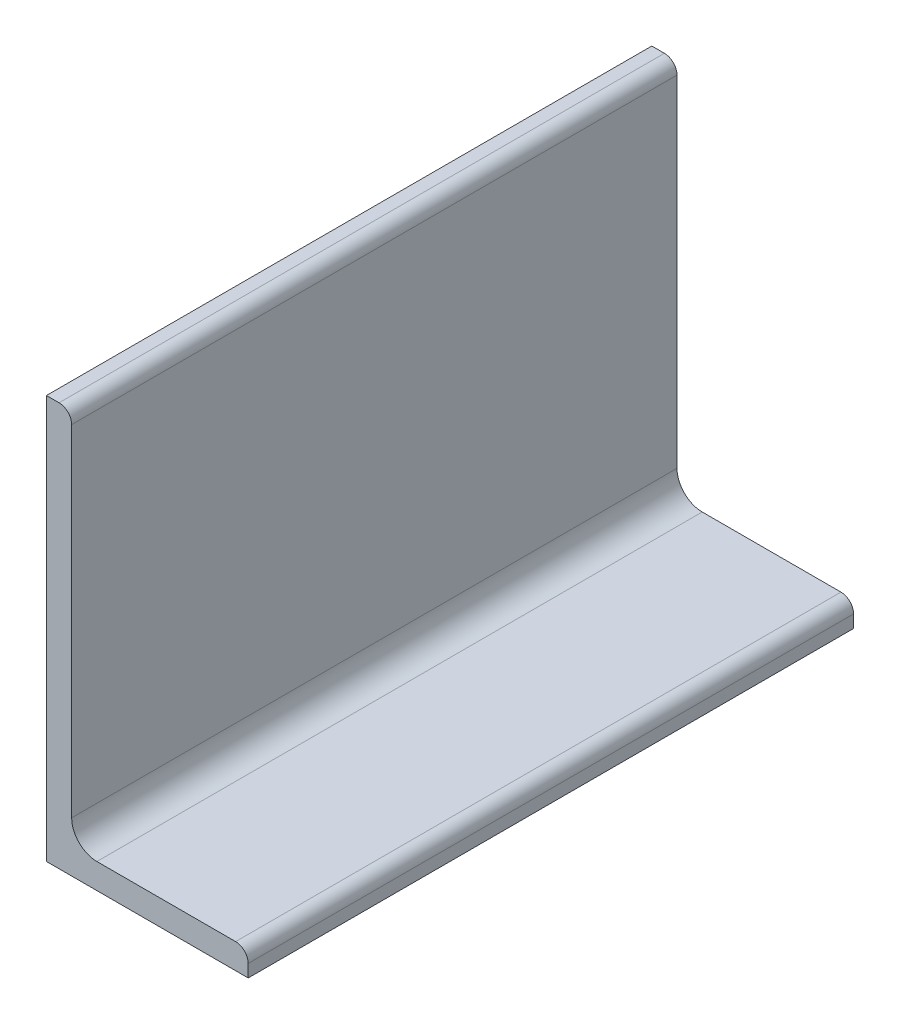
ISO-10303-21;
HEADER;
FILE_DESCRIPTION(('STEP AP214'),'2;1');
FILE_NAME('part.step','',(''),(''),'','','');
FILE_SCHEMA(('AUTOMOTIVE_DESIGN { 1 0 10303 214 1 1 1 1 }'));
ENDSEC;
DATA;
#1=APPLICATION_CONTEXT('core data for automotive mechanical design processes');
#2=APPLICATION_PROTOCOL_DEFINITION('international standard','automotive_design',2000,#1);
#3=PRODUCT_CONTEXT('',#1,'mechanical');
#4=PRODUCT('Part','Part','',(#3));
#5=PRODUCT_RELATED_PRODUCT_CATEGORY('part','',(#4));
#6=PRODUCT_DEFINITION_FORMATION('','',#4);
#7=PRODUCT_DEFINITION_CONTEXT('part definition',#1,'design');
#8=PRODUCT_DEFINITION('design','',#6,#7);
#9=PRODUCT_DEFINITION_SHAPE('','',#8);
#10=(LENGTH_UNIT() NAMED_UNIT(*) SI_UNIT(.MILLI.,.METRE.));
#11=(NAMED_UNIT(*) PLANE_ANGLE_UNIT() SI_UNIT($,.RADIAN.));
#12=(NAMED_UNIT(*) SI_UNIT($,.STERADIAN.) SOLID_ANGLE_UNIT());
#13=UNCERTAINTY_MEASURE_WITH_UNIT(LENGTH_MEASURE(1.E-05),#10,'distance_accuracy_value','');
#14=(GEOMETRIC_REPRESENTATION_CONTEXT(3) GLOBAL_UNCERTAINTY_ASSIGNED_CONTEXT((#13)) GLOBAL_UNIT_ASSIGNED_CONTEXT((#10,
#11,#12)) REPRESENTATION_CONTEXT('',''));
#15=CARTESIAN_POINT('',(0.,0.,0.));
#16=DIRECTION('',(0.,0.,1.));
#17=DIRECTION('',(1.,0.,0.));
#18=AXIS2_PLACEMENT_3D('',#15,#16,#17);
#19=CARTESIAN_POINT('',(0.865045893659089,203.678837479771,304.8));
#20=DIRECTION('',(1.,0.,0.));
#21=DIRECTION('',(0.,0.,-1.));
#22=AXIS2_PLACEMENT_3D('',#19,#20,#21);
#23=PLANE('',#22);
#24=DIRECTION('',(0.,-1.,0.));
#25=VECTOR('',#24,1.);
#26=CARTESIAN_POINT('',(0.865045893659089,203.678837479771,0.));
#27=LINE('',#26,#25);
#28=CARTESIAN_POINT('',(0.865045893659089,203.678837479771,0.));
#29=VERTEX_POINT('',#28);
#30=CARTESIAN_POINT('',(0.865045893659089,0.478837479771528,0.));
#31=VERTEX_POINT('',#30);
#32=EDGE_CURVE('E135',#29,#31,#27,.T.);
#33=ORIENTED_EDGE('',*,*,#32,.T.);
#34=DIRECTION('',(0.,0.,-1.));
#35=VECTOR('',#34,1.);
#36=CARTESIAN_POINT('',(0.865045893659089,0.478837479771528,304.8));
#37=LINE('',#36,#35);
#38=CARTESIAN_POINT('',(0.865045893659089,0.478837479771528,304.8));
#39=VERTEX_POINT('',#38);
#40=EDGE_CURVE('E11',#39,#31,#37,.T.);
#41=ORIENTED_EDGE('',*,*,#40,.F.);
#42=DIRECTION('',(0.,-1.,0.));
#43=VECTOR('',#42,1.);
#44=CARTESIAN_POINT('',(0.865045893659089,203.678837479771,304.8));
#45=LINE('',#44,#43);
#46=CARTESIAN_POINT('',(0.865045893659089,203.678837479771,304.8));
#47=VERTEX_POINT('',#46);
#48=EDGE_CURVE('E151',#47,#39,#45,.T.);
#49=ORIENTED_EDGE('',*,*,#48,.F.);
#50=DIRECTION('',(0.,0.,-1.));
#51=VECTOR('',#50,1.);
#52=CARTESIAN_POINT('',(0.865045893659089,203.678837479771,304.8));
#53=LINE('',#52,#51);
#54=EDGE_CURVE('E131',#47,#29,#53,.T.);
#55=ORIENTED_EDGE('',*,*,#54,.T.);
#56=EDGE_LOOP('',(#33,#41,#49,#55));
#57=FACE_BOUND('',#56,.T.);
#58=ADVANCED_FACE('F33',(#57),#23,.F.);
#59=CARTESIAN_POINT('',(0.865045893659089,0.478837479771528,304.8));
#60=DIRECTION('',(0.,1.,0.));
#61=DIRECTION('',(0.,0.,1.));
#62=AXIS2_PLACEMENT_3D('',#59,#60,#61);
#63=PLANE('',#62);
#64=DIRECTION('',(1.,0.,0.));
#65=VECTOR('',#64,1.);
#66=CARTESIAN_POINT('',(0.865045893659089,0.478837479771528,0.));
#67=LINE('',#66,#65);
#68=CARTESIAN_POINT('',(102.465045893659,0.478837479771528,0.));
#69=VERTEX_POINT('',#68);
#70=EDGE_CURVE('E138',#31,#69,#67,.T.);
#71=ORIENTED_EDGE('',*,*,#70,.T.);
#72=DIRECTION('',(0.,0.,-1.));
#73=VECTOR('',#72,1.);
#74=CARTESIAN_POINT('',(102.465045893659,0.478837479771528,304.8));
#75=LINE('',#74,#73);
#76=CARTESIAN_POINT('',(102.465045893659,0.478837479771528,304.8));
#77=VERTEX_POINT('',#76);
#78=EDGE_CURVE('E41',#77,#69,#75,.T.);
#79=ORIENTED_EDGE('',*,*,#78,.F.);
#80=DIRECTION('',(1.,0.,0.));
#81=VECTOR('',#80,1.);
#82=CARTESIAN_POINT('',(0.865045893659089,0.478837479771528,304.8));
#83=LINE('',#82,#81);
#84=EDGE_CURVE('E95',#39,#77,#83,.T.);
#85=ORIENTED_EDGE('',*,*,#84,.F.);
#86=ORIENTED_EDGE('',*,*,#40,.T.);
#87=EDGE_LOOP('',(#71,#79,#85,#86));
#88=FACE_BOUND('',#87,.T.);
#89=ADVANCED_FACE('F194',(#88),#63,.F.);
#90=CARTESIAN_POINT('',(102.465045893659,0.478837479771528,304.8));
#91=DIRECTION('',(-1.,0.,0.));
#92=DIRECTION('',(0.,0.,1.));
#93=AXIS2_PLACEMENT_3D('',#90,#91,#92);
#94=PLANE('',#93);
#95=DIRECTION('',(0.,1.,0.));
#96=VECTOR('',#95,1.);
#97=CARTESIAN_POINT('',(102.465045893659,0.478837479771528,0.));
#98=LINE('',#97,#96);
#99=CARTESIAN_POINT('',(102.465045893659,6.82883747977153,0.));
#100=VERTEX_POINT('',#99);
#101=EDGE_CURVE('E140',#69,#100,#98,.T.);
#102=ORIENTED_EDGE('',*,*,#101,.T.);
#103=DIRECTION('',(0.,0.,-1.));
#104=VECTOR('',#103,1.);
#105=CARTESIAN_POINT('',(102.465045893659,6.82883747977153,304.8));
#106=LINE('',#105,#104);
#107=CARTESIAN_POINT('',(102.465045893659,6.82883747977153,304.8));
#108=VERTEX_POINT('',#107);
#109=EDGE_CURVE('E161',#108,#100,#106,.T.);
#110=ORIENTED_EDGE('',*,*,#109,.F.);
#111=DIRECTION('',(0.,1.,0.));
#112=VECTOR('',#111,1.);
#113=CARTESIAN_POINT('',(102.465045893659,0.478837479771528,304.8));
#114=LINE('',#113,#112);
#115=EDGE_CURVE('E169',#77,#108,#114,.T.);
#116=ORIENTED_EDGE('',*,*,#115,.F.);
#117=ORIENTED_EDGE('',*,*,#78,.T.);
#118=EDGE_LOOP('',(#102,#110,#116,#117));
#119=FACE_BOUND('',#118,.T.);
#120=ADVANCED_FACE('F167',(#119),#94,.F.);
#121=CARTESIAN_POINT('',(96.1150458936591,6.82883747977153,304.8));
#122=DIRECTION('',(0.,0.,-1.));
#123=DIRECTION('',(-1.,0.,0.));
#124=AXIS2_PLACEMENT_3D('',#121,#122,#123);
#125=CYLINDRICAL_SURFACE('',#124,6.35);
#126=CARTESIAN_POINT('',(96.1150458936591,6.82883747977153,0.));
#127=DIRECTION('',(0.,0.,1.));
#128=DIRECTION('',(1.,0.,0.));
#129=AXIS2_PLACEMENT_3D('',#126,#127,#128);
#130=CIRCLE('',#129,6.35);
#131=CARTESIAN_POINT('',(96.1150458936591,13.1788374797715,0.));
#132=VERTEX_POINT('',#131);
#133=EDGE_CURVE('E142',#100,#132,#130,.T.);
#134=ORIENTED_EDGE('',*,*,#133,.T.);
#135=DIRECTION('',(0.,0.,-1.));
#136=VECTOR('',#135,1.);
#137=CARTESIAN_POINT('',(96.1150458936591,13.1788374797715,304.8));
#138=LINE('',#137,#136);
#139=CARTESIAN_POINT('',(96.1150458936591,13.1788374797715,304.8));
#140=VERTEX_POINT('',#139);
#141=EDGE_CURVE('E158',#140,#132,#138,.T.);
#142=ORIENTED_EDGE('',*,*,#141,.F.);
#143=CARTESIAN_POINT('',(96.1150458936591,6.82883747977153,304.8));
#144=DIRECTION('',(0.,0.,1.));
#145=DIRECTION('',(1.,0.,0.));
#146=AXIS2_PLACEMENT_3D('',#143,#144,#145);
#147=CIRCLE('',#146,6.35);
#148=EDGE_CURVE('E185',#108,#140,#147,.T.);
#149=ORIENTED_EDGE('',*,*,#148,.F.);
#150=ORIENTED_EDGE('',*,*,#109,.T.);
#151=EDGE_LOOP('',(#134,#142,#149,#150));
#152=FACE_BOUND('',#151,.T.);
#153=ADVANCED_FACE('F178',(#152),#125,.T.);
#154=CARTESIAN_POINT('',(96.1150458936591,13.1788374797715,304.8));
#155=DIRECTION('',(0.,-1.,0.));
#156=DIRECTION('',(0.,0.,-1.));
#157=AXIS2_PLACEMENT_3D('',#154,#155,#156);
#158=PLANE('',#157);
#159=DIRECTION('',(-1.,0.,0.));
#160=VECTOR('',#159,1.);
#161=CARTESIAN_POINT('',(96.1150458936591,13.1788374797715,0.));
#162=LINE('',#161,#160);
#163=CARTESIAN_POINT('',(26.2650458936591,13.1788374797715,0.));
#164=VERTEX_POINT('',#163);
#165=EDGE_CURVE('E144',#132,#164,#162,.T.);
#166=ORIENTED_EDGE('',*,*,#165,.T.);
#167=DIRECTION('',(0.,0.,-1.));
#168=VECTOR('',#167,1.);
#169=CARTESIAN_POINT('',(26.2650458936591,13.1788374797715,304.8));
#170=LINE('',#169,#168);
#171=CARTESIAN_POINT('',(26.2650458936591,13.1788374797715,304.8));
#172=VERTEX_POINT('',#171);
#173=EDGE_CURVE('E155',#172,#164,#170,.T.);
#174=ORIENTED_EDGE('',*,*,#173,.F.);
#175=DIRECTION('',(-1.,0.,0.));
#176=VECTOR('',#175,1.);
#177=CARTESIAN_POINT('',(96.1150458936591,13.1788374797715,304.8));
#178=LINE('',#177,#176);
#179=EDGE_CURVE('E184',#140,#172,#178,.T.);
#180=ORIENTED_EDGE('',*,*,#179,.F.);
#181=ORIENTED_EDGE('',*,*,#141,.T.);
#182=EDGE_LOOP('',(#166,#174,#180,#181));
#183=FACE_BOUND('',#182,.T.);
#184=ADVANCED_FACE('F182',(#183),#158,.F.);
#185=CARTESIAN_POINT('',(26.2650458936591,25.8788374797715,304.8));
#186=DIRECTION('',(0.,0.,-1.));
#187=DIRECTION('',(-1.,0.,0.));
#188=AXIS2_PLACEMENT_3D('',#185,#186,#187);
#189=CYLINDRICAL_SURFACE('',#188,12.7);
#190=CARTESIAN_POINT('',(26.2650458936591,25.8788374797715,0.));
#191=DIRECTION('',(0.,0.,-1.));
#192=DIRECTION('',(1.,0.,0.));
#193=AXIS2_PLACEMENT_3D('',#190,#191,#192);
#194=CIRCLE('',#193,12.7);
#195=CARTESIAN_POINT('',(13.5650458936591,25.8788374797715,0.));
#196=VERTEX_POINT('',#195);
#197=EDGE_CURVE('E146',#164,#196,#194,.T.);
#198=ORIENTED_EDGE('',*,*,#197,.T.);
#199=DIRECTION('',(0.,0.,-1.));
#200=VECTOR('',#199,1.);
#201=CARTESIAN_POINT('',(13.5650458936591,25.8788374797715,304.8));
#202=LINE('',#201,#200);
#203=CARTESIAN_POINT('',(13.5650458936591,25.8788374797715,304.8));
#204=VERTEX_POINT('',#203);
#205=EDGE_CURVE('E126',#204,#196,#202,.T.);
#206=ORIENTED_EDGE('',*,*,#205,.F.);
#207=CARTESIAN_POINT('',(26.2650458936591,25.8788374797715,304.8));
#208=DIRECTION('',(0.,0.,-1.));
#209=DIRECTION('',(1.,0.,0.));
#210=AXIS2_PLACEMENT_3D('',#207,#208,#209);
#211=CIRCLE('',#210,12.7);
#212=EDGE_CURVE('E117',#172,#204,#211,.T.);
#213=ORIENTED_EDGE('',*,*,#212,.F.);
#214=ORIENTED_EDGE('',*,*,#173,.T.);
#215=EDGE_LOOP('',(#198,#206,#213,#214));
#216=FACE_BOUND('',#215,.T.);
#217=ADVANCED_FACE('F206',(#216),#189,.F.);
#218=CARTESIAN_POINT('',(13.5650458936591,25.8788374797715,304.8));
#219=DIRECTION('',(-1.,0.,0.));
#220=DIRECTION('',(0.,0.,1.));
#221=AXIS2_PLACEMENT_3D('',#218,#219,#220);
#222=PLANE('',#221);
#223=DIRECTION('',(0.,1.,0.));
#224=VECTOR('',#223,1.);
#225=CARTESIAN_POINT('',(13.5650458936591,25.8788374797715,0.));
#226=LINE('',#225,#224);
#227=CARTESIAN_POINT('',(13.5650458936591,197.328837479771,0.));
#228=VERTEX_POINT('',#227);
#229=EDGE_CURVE('E125',#196,#228,#226,.T.);
#230=ORIENTED_EDGE('',*,*,#229,.T.);
#231=DIRECTION('',(0.,0.,-1.));
#232=VECTOR('',#231,1.);
#233=CARTESIAN_POINT('',(13.5650458936591,197.328837479771,304.8));
#234=LINE('',#233,#232);
#235=CARTESIAN_POINT('',(13.5650458936591,197.328837479771,304.8));
#236=VERTEX_POINT('',#235);
#237=EDGE_CURVE('E122',#236,#228,#234,.T.);
#238=ORIENTED_EDGE('',*,*,#237,.F.);
#239=DIRECTION('',(0.,1.,0.));
#240=VECTOR('',#239,1.);
#241=CARTESIAN_POINT('',(13.5650458936591,25.8788374797715,304.8));
#242=LINE('',#241,#240);
#243=EDGE_CURVE('E111',#204,#236,#242,.T.);
#244=ORIENTED_EDGE('',*,*,#243,.F.);
#245=ORIENTED_EDGE('',*,*,#205,.T.);
#246=EDGE_LOOP('',(#230,#238,#244,#245));
#247=FACE_BOUND('',#246,.T.);
#248=ADVANCED_FACE('F123',(#247),#222,.F.);
#249=CARTESIAN_POINT('',(7.21504589365907,197.328837479771,304.8));
#250=DIRECTION('',(0.,0.,-1.));
#251=DIRECTION('',(-1.,0.,0.));
#252=AXIS2_PLACEMENT_3D('',#249,#250,#251);
#253=CYLINDRICAL_SURFACE('',#252,6.35);
#254=CARTESIAN_POINT('',(7.21504589365907,197.328837479771,0.));
#255=DIRECTION('',(0.,0.,1.));
#256=DIRECTION('',(1.,0.,0.));
#257=AXIS2_PLACEMENT_3D('',#254,#255,#256);
#258=CIRCLE('',#257,6.35);
#259=CARTESIAN_POINT('',(7.21504589365909,203.678837479771,0.));
#260=VERTEX_POINT('',#259);
#261=EDGE_CURVE('E81',#228,#260,#258,.T.);
#262=ORIENTED_EDGE('',*,*,#261,.T.);
#263=DIRECTION('',(0.,0.,-1.));
#264=VECTOR('',#263,1.);
#265=CARTESIAN_POINT('',(7.21504589365909,203.678837479771,304.8));
#266=LINE('',#265,#264);
#267=CARTESIAN_POINT('',(7.21504589365909,203.678837479771,304.8));
#268=VERTEX_POINT('',#267);
#269=EDGE_CURVE('E127',#268,#260,#266,.T.);
#270=ORIENTED_EDGE('',*,*,#269,.F.);
#271=CARTESIAN_POINT('',(7.21504589365907,197.328837479771,304.8));
#272=DIRECTION('',(0.,0.,1.));
#273=DIRECTION('',(1.,0.,0.));
#274=AXIS2_PLACEMENT_3D('',#271,#272,#273);
#275=CIRCLE('',#274,6.35);
#276=EDGE_CURVE('E115',#236,#268,#275,.T.);
#277=ORIENTED_EDGE('',*,*,#276,.F.);
#278=ORIENTED_EDGE('',*,*,#237,.T.);
#279=EDGE_LOOP('',(#262,#270,#277,#278));
#280=FACE_BOUND('',#279,.T.);
#281=ADVANCED_FACE('F129',(#280),#253,.T.);
#282=CARTESIAN_POINT('',(7.21504589365909,203.678837479771,304.8));
#283=DIRECTION('',(0.,-1.,0.));
#284=DIRECTION('',(0.,0.,-1.));
#285=AXIS2_PLACEMENT_3D('',#282,#283,#284);
#286=PLANE('',#285);
#287=DIRECTION('',(-1.,0.,0.));
#288=VECTOR('',#287,1.);
#289=CARTESIAN_POINT('',(7.21504589365909,203.678837479771,0.));
#290=LINE('',#289,#288);
#291=EDGE_CURVE('E87',#260,#29,#290,.T.);
#292=ORIENTED_EDGE('',*,*,#291,.T.);
#293=ORIENTED_EDGE('',*,*,#54,.F.);
#294=DIRECTION('',(-1.,0.,0.));
#295=VECTOR('',#294,1.);
#296=CARTESIAN_POINT('',(7.21504589365909,203.678837479771,304.8));
#297=LINE('',#296,#295);
#298=EDGE_CURVE('E49',#268,#47,#297,.T.);
#299=ORIENTED_EDGE('',*,*,#298,.F.);
#300=ORIENTED_EDGE('',*,*,#269,.T.);
#301=EDGE_LOOP('',(#292,#293,#299,#300));
#302=FACE_BOUND('',#301,.T.);
#303=ADVANCED_FACE('F214',(#302),#286,.F.);
#304=CARTESIAN_POINT('',(96.1150458936591,6.82883747977153,304.8));
#305=DIRECTION('',(0.,0.,1.));
#306=DIRECTION('',(1.,0.,0.));
#307=AXIS2_PLACEMENT_3D('',#304,#305,#306);
#308=PLANE('',#307);
#309=ORIENTED_EDGE('',*,*,#48,.T.);
#310=ORIENTED_EDGE('',*,*,#84,.T.);
#311=ORIENTED_EDGE('',*,*,#115,.T.);
#312=ORIENTED_EDGE('',*,*,#148,.T.);
#313=ORIENTED_EDGE('',*,*,#179,.T.);
#314=ORIENTED_EDGE('',*,*,#212,.T.);
#315=ORIENTED_EDGE('',*,*,#243,.T.);
#316=ORIENTED_EDGE('',*,*,#276,.T.);
#317=ORIENTED_EDGE('',*,*,#298,.T.);
#318=EDGE_LOOP('',(#309,#310,#311,#312,#313,#314,#315,#316,#317));
#319=FACE_BOUND('',#318,.T.);
#320=ADVANCED_FACE('F113',(#319),#308,.T.);
#321=CARTESIAN_POINT('',(96.1150458936591,6.82883747977153,0.));
#322=DIRECTION('',(0.,0.,1.));
#323=DIRECTION('',(1.,0.,0.));
#324=AXIS2_PLACEMENT_3D('',#321,#322,#323);
#325=PLANE('',#324);
#326=ORIENTED_EDGE('',*,*,#32,.F.);
#327=ORIENTED_EDGE('',*,*,#291,.F.);
#328=ORIENTED_EDGE('',*,*,#261,.F.);
#329=ORIENTED_EDGE('',*,*,#229,.F.);
#330=ORIENTED_EDGE('',*,*,#197,.F.);
#331=ORIENTED_EDGE('',*,*,#165,.F.);
#332=ORIENTED_EDGE('',*,*,#133,.F.);
#333=ORIENTED_EDGE('',*,*,#101,.F.);
#334=ORIENTED_EDGE('',*,*,#70,.F.);
#335=EDGE_LOOP('',(#326,#327,#328,#329,#330,#331,#332,#333,#334));
#336=FACE_BOUND('',#335,.T.);
#337=ADVANCED_FACE('F173',(#336),#325,.F.);
#338=CLOSED_SHELL('',(#58,#89,#120,#153,#184,#217,#248,#281,#303,#320,#337));
#339=MANIFOLD_SOLID_BREP('B2',#338);
#340=ADVANCED_BREP_SHAPE_REPRESENTATION('',(#18,#339),#14);
#341=SHAPE_DEFINITION_REPRESENTATION(#9,#340);
ENDSEC;
END-ISO-10303-21;
